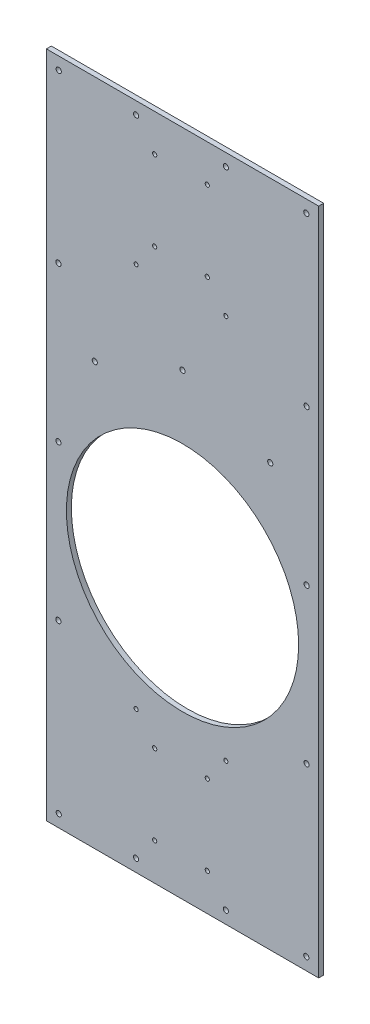
ISO-10303-21;
HEADER;
FILE_DESCRIPTION(('STEP AP214'),'2;1');
FILE_NAME('part.step','',(''),(''),'','','');
FILE_SCHEMA(('AUTOMOTIVE_DESIGN { 1 0 10303 214 1 1 1 1 }'));
ENDSEC;
DATA;
#1=APPLICATION_CONTEXT('core data for automotive mechanical design processes');
#2=APPLICATION_PROTOCOL_DEFINITION('international standard','automotive_design',2000,#1);
#3=PRODUCT_CONTEXT('',#1,'mechanical');
#4=PRODUCT('Part','Part','',(#3));
#5=PRODUCT_RELATED_PRODUCT_CATEGORY('part','',(#4));
#6=PRODUCT_DEFINITION_FORMATION('','',#4);
#7=PRODUCT_DEFINITION_CONTEXT('part definition',#1,'design');
#8=PRODUCT_DEFINITION('design','',#6,#7);
#9=PRODUCT_DEFINITION_SHAPE('','',#8);
#10=(LENGTH_UNIT() NAMED_UNIT(*) SI_UNIT(.MILLI.,.METRE.));
#11=(NAMED_UNIT(*) PLANE_ANGLE_UNIT() SI_UNIT($,.RADIAN.));
#12=(NAMED_UNIT(*) SI_UNIT($,.STERADIAN.) SOLID_ANGLE_UNIT());
#13=UNCERTAINTY_MEASURE_WITH_UNIT(LENGTH_MEASURE(1.E-05),#10,'distance_accuracy_value','');
#14=(GEOMETRIC_REPRESENTATION_CONTEXT(3) GLOBAL_UNCERTAINTY_ASSIGNED_CONTEXT((#13)) GLOBAL_UNIT_ASSIGNED_CONTEXT((#10,
#11,#12)) REPRESENTATION_CONTEXT('',''));
#15=CARTESIAN_POINT('',(0.,0.,0.));
#16=DIRECTION('',(0.,0.,1.));
#17=DIRECTION('',(1.,0.,0.));
#18=AXIS2_PLACEMENT_3D('',#15,#16,#17);
#19=CARTESIAN_POINT('',(110.,-270.,4.));
#20=DIRECTION('',(-1.,0.,0.));
#21=DIRECTION('',(0.,-1.,0.));
#22=AXIS2_PLACEMENT_3D('',#19,#20,#21);
#23=PLANE('',#22);
#24=DIRECTION('',(0.,1.,0.));
#25=VECTOR('',#24,1.);
#26=CARTESIAN_POINT('',(110.,-270.,0.));
#27=LINE('',#26,#25);
#28=CARTESIAN_POINT('',(110.,-270.,0.));
#29=VERTEX_POINT('',#28);
#30=CARTESIAN_POINT('',(110.,270.,0.));
#31=VERTEX_POINT('',#30);
#32=EDGE_CURVE('E111',#29,#31,#27,.T.);
#33=ORIENTED_EDGE('',*,*,#32,.T.);
#34=DIRECTION('',(0.,0.,-1.));
#35=VECTOR('',#34,1.);
#36=CARTESIAN_POINT('',(110.,270.,4.));
#37=LINE('',#36,#35);
#38=CARTESIAN_POINT('',(110.,270.,4.));
#39=VERTEX_POINT('',#38);
#40=EDGE_CURVE('E11',#39,#31,#37,.T.);
#41=ORIENTED_EDGE('',*,*,#40,.F.);
#42=DIRECTION('',(0.,1.,0.));
#43=VECTOR('',#42,1.);
#44=CARTESIAN_POINT('',(110.,-270.,4.));
#45=LINE('',#44,#43);
#46=CARTESIAN_POINT('',(110.,-270.,4.));
#47=VERTEX_POINT('',#46);
#48=EDGE_CURVE('E98',#47,#39,#45,.T.);
#49=ORIENTED_EDGE('',*,*,#48,.F.);
#50=DIRECTION('',(0.,0.,-1.));
#51=VECTOR('',#50,1.);
#52=CARTESIAN_POINT('',(110.,-270.,4.));
#53=LINE('',#52,#51);
#54=EDGE_CURVE('E107',#47,#29,#53,.T.);
#55=ORIENTED_EDGE('',*,*,#54,.T.);
#56=EDGE_LOOP('',(#33,#41,#49,#55));
#57=FACE_BOUND('',#56,.T.);
#58=ADVANCED_FACE('F45',(#57),#23,.F.);
#59=CARTESIAN_POINT('',(-110.,270.,4.));
#60=DIRECTION('',(0.,-1.,0.));
#61=DIRECTION('',(0.,0.,-1.));
#62=AXIS2_PLACEMENT_3D('',#59,#60,#61);
#63=PLANE('',#62);
#64=DIRECTION('',(-1.,0.,0.));
#65=VECTOR('',#64,1.);
#66=CARTESIAN_POINT('',(-110.,270.,0.));
#67=LINE('',#66,#65);
#68=CARTESIAN_POINT('',(-110.,270.,0.));
#69=VERTEX_POINT('',#68);
#70=EDGE_CURVE('E102',#31,#69,#67,.T.);
#71=ORIENTED_EDGE('',*,*,#70,.T.);
#72=DIRECTION('',(0.,0.,-1.));
#73=VECTOR('',#72,1.);
#74=CARTESIAN_POINT('',(-110.,270.,4.));
#75=LINE('',#74,#73);
#76=CARTESIAN_POINT('',(-110.,270.,4.));
#77=VERTEX_POINT('',#76);
#78=EDGE_CURVE('E54',#77,#69,#75,.T.);
#79=ORIENTED_EDGE('',*,*,#78,.F.);
#80=DIRECTION('',(-1.,0.,0.));
#81=VECTOR('',#80,1.);
#82=CARTESIAN_POINT('',(-110.,270.,4.));
#83=LINE('',#82,#81);
#84=EDGE_CURVE('E93',#39,#77,#83,.T.);
#85=ORIENTED_EDGE('',*,*,#84,.F.);
#86=ORIENTED_EDGE('',*,*,#40,.T.);
#87=EDGE_LOOP('',(#71,#79,#85,#86));
#88=FACE_BOUND('',#87,.T.);
#89=ADVANCED_FACE('F101',(#88),#63,.F.);
#90=CARTESIAN_POINT('',(-110.,-270.,4.));
#91=DIRECTION('',(1.,0.,0.));
#92=DIRECTION('',(0.,1.,0.));
#93=AXIS2_PLACEMENT_3D('',#90,#91,#92);
#94=PLANE('',#93);
#95=DIRECTION('',(0.,-1.,0.));
#96=VECTOR('',#95,1.);
#97=CARTESIAN_POINT('',(-110.,-270.,0.));
#98=LINE('',#97,#96);
#99=CARTESIAN_POINT('',(-110.,-270.,0.));
#100=VERTEX_POINT('',#99);
#101=EDGE_CURVE('E80',#69,#100,#98,.T.);
#102=ORIENTED_EDGE('',*,*,#101,.T.);
#103=DIRECTION('',(0.,0.,-1.));
#104=VECTOR('',#103,1.);
#105=CARTESIAN_POINT('',(-110.,-270.,4.));
#106=LINE('',#105,#104);
#107=CARTESIAN_POINT('',(-110.,-270.,4.));
#108=VERTEX_POINT('',#107);
#109=EDGE_CURVE('E103',#108,#100,#106,.T.);
#110=ORIENTED_EDGE('',*,*,#109,.F.);
#111=DIRECTION('',(0.,-1.,0.));
#112=VECTOR('',#111,1.);
#113=CARTESIAN_POINT('',(-110.,-270.,4.));
#114=LINE('',#113,#112);
#115=EDGE_CURVE('E96',#77,#108,#114,.T.);
#116=ORIENTED_EDGE('',*,*,#115,.F.);
#117=ORIENTED_EDGE('',*,*,#78,.T.);
#118=EDGE_LOOP('',(#102,#110,#116,#117));
#119=FACE_BOUND('',#118,.T.);
#120=ADVANCED_FACE('F105',(#119),#94,.F.);
#121=CARTESIAN_POINT('',(-110.,-270.,4.));
#122=DIRECTION('',(0.,1.,0.));
#123=DIRECTION('',(0.,0.,1.));
#124=AXIS2_PLACEMENT_3D('',#121,#122,#123);
#125=PLANE('',#124);
#126=DIRECTION('',(1.,0.,0.));
#127=VECTOR('',#126,1.);
#128=CARTESIAN_POINT('',(-110.,-270.,0.));
#129=LINE('',#128,#127);
#130=EDGE_CURVE('E86',#100,#29,#129,.T.);
#131=ORIENTED_EDGE('',*,*,#130,.T.);
#132=ORIENTED_EDGE('',*,*,#54,.F.);
#133=DIRECTION('',(1.,0.,0.));
#134=VECTOR('',#133,1.);
#135=CARTESIAN_POINT('',(-110.,-270.,4.));
#136=LINE('',#135,#134);
#137=EDGE_CURVE('E63',#108,#47,#136,.T.);
#138=ORIENTED_EDGE('',*,*,#137,.F.);
#139=ORIENTED_EDGE('',*,*,#109,.T.);
#140=EDGE_LOOP('',(#131,#132,#138,#139));
#141=FACE_BOUND('',#140,.T.);
#142=ADVANCED_FACE('F216',(#141),#125,.F.);
#143=CARTESIAN_POINT('',(0.,0.,4.));
#144=DIRECTION('',(0.,0.,-1.));
#145=DIRECTION('',(-1.,0.,0.));
#146=AXIS2_PLACEMENT_3D('',#143,#144,#145);
#147=PLANE('',#146);
#148=CARTESIAN_POINT('',(-37.5000000000005,-155.525642790935,4.));
#149=DIRECTION('',(0.,0.,1.));
#150=DIRECTION('',(-1.,0.,0.));
#151=AXIS2_PLACEMENT_3D('',#148,#149,#150);
#152=CIRCLE('',#151,1.65000000000016);
#153=CARTESIAN_POINT('',(-39.1500000000006,-155.525642790935,4.));
#154=VERTEX_POINT('',#153);
#155=EDGE_CURVE('E561',#154,#154,#152,.T.);
#156=ORIENTED_EDGE('',*,*,#155,.F.);
#157=EDGE_LOOP('',(#156));
#158=FACE_BOUND('',#157,.T.);
#159=CARTESIAN_POINT('',(19.9999999999996,-239.999999999999,4.));
#160=DIRECTION('',(0.,0.,1.));
#161=DIRECTION('',(-1.,0.,0.));
#162=AXIS2_PLACEMENT_3D('',#159,#160,#161);
#163=CIRCLE('',#162,1.7000000000006);
#164=CARTESIAN_POINT('',(18.299999999999,-239.999999999999,4.));
#165=VERTEX_POINT('',#164);
#166=EDGE_CURVE('E577',#165,#165,#163,.T.);
#167=ORIENTED_EDGE('',*,*,#166,.F.);
#168=EDGE_LOOP('',(#167));
#169=FACE_BOUND('',#168,.T.);
#170=CARTESIAN_POINT('',(-22.5000000000005,-175.525642790935,4.));
#171=DIRECTION('',(0.,0.,1.));
#172=DIRECTION('',(-1.,0.,0.));
#173=AXIS2_PLACEMENT_3D('',#170,#171,#172);
#174=CIRCLE('',#173,1.70000000000016);
#175=CARTESIAN_POINT('',(-24.2000000000006,-175.525642790935,4.));
#176=VERTEX_POINT('',#175);
#177=EDGE_CURVE('E756',#176,#176,#174,.T.);
#178=ORIENTED_EDGE('',*,*,#177,.F.);
#179=EDGE_LOOP('',(#178));
#180=FACE_BOUND('',#179,.T.);
#181=CARTESIAN_POINT('',(19.9999999999995,-175.525642790936,4.));
#182=DIRECTION('',(0.,0.,1.));
#183=DIRECTION('',(-1.,0.,0.));
#184=AXIS2_PLACEMENT_3D('',#181,#182,#183);
#185=CIRCLE('',#184,1.70000000000015);
#186=CARTESIAN_POINT('',(18.2999999999994,-175.525642790936,4.));
#187=VERTEX_POINT('',#186);
#188=EDGE_CURVE('E764',#187,#187,#185,.T.);
#189=ORIENTED_EDGE('',*,*,#188,.F.);
#190=EDGE_LOOP('',(#189));
#191=FACE_BOUND('',#190,.T.);
#192=CARTESIAN_POINT('',(34.9999999999995,-155.525642790935,4.));
#193=DIRECTION('',(0.,0.,1.));
#194=DIRECTION('',(-1.,0.,0.));
#195=AXIS2_PLACEMENT_3D('',#192,#193,#194);
#196=CIRCLE('',#195,1.65000000000015);
#197=CARTESIAN_POINT('',(33.3499999999994,-155.525642790935,4.));
#198=VERTEX_POINT('',#197);
#199=EDGE_CURVE('E772',#198,#198,#196,.T.);
#200=ORIENTED_EDGE('',*,*,#199,.F.);
#201=EDGE_LOOP('',(#200));
#202=FACE_BOUND('',#201,.T.);
#203=CARTESIAN_POINT('',(-22.5000000000004,-239.999999999999,4.));
#204=DIRECTION('',(0.,0.,1.));
#205=DIRECTION('',(-1.,0.,0.));
#206=AXIS2_PLACEMENT_3D('',#203,#204,#205);
#207=CIRCLE('',#206,1.70000000000059);
#208=CARTESIAN_POINT('',(-24.200000000001,-239.999999999999,4.));
#209=VERTEX_POINT('',#208);
#210=EDGE_CURVE('E570',#209,#209,#207,.T.);
#211=ORIENTED_EDGE('',*,*,#210,.F.);
#212=EDGE_LOOP('',(#211));
#213=FACE_BOUND('',#212,.T.);
#214=CARTESIAN_POINT('',(-37.5000000000005,155.525642790935,4.));
#215=DIRECTION('',(0.,0.,-1.));
#216=DIRECTION('',(-1.,0.,0.));
#217=AXIS2_PLACEMENT_3D('',#214,#215,#216);
#218=CIRCLE('',#217,1.65000000000016);
#219=CARTESIAN_POINT('',(-39.1500000000006,155.525642790935,4.));
#220=VERTEX_POINT('',#219);
#221=EDGE_CURVE('E591',#220,#220,#218,.T.);
#222=ORIENTED_EDGE('',*,*,#221,.T.);
#223=EDGE_LOOP('',(#222));
#224=FACE_BOUND('',#223,.T.);
#225=CARTESIAN_POINT('',(19.9999999999996,239.999999999999,4.));
#226=DIRECTION('',(0.,0.,-1.));
#227=DIRECTION('',(-1.,0.,0.));
#228=AXIS2_PLACEMENT_3D('',#225,#226,#227);
#229=CIRCLE('',#228,1.7000000000006);
#230=CARTESIAN_POINT('',(18.299999999999,239.999999999999,4.));
#231=VERTEX_POINT('',#230);
#232=EDGE_CURVE('E592',#231,#231,#229,.T.);
#233=ORIENTED_EDGE('',*,*,#232,.T.);
#234=EDGE_LOOP('',(#233));
#235=FACE_BOUND('',#234,.T.);
#236=CARTESIAN_POINT('',(-22.5000000000005,175.525642790935,4.));
#237=DIRECTION('',(0.,0.,-1.));
#238=DIRECTION('',(-1.,0.,0.));
#239=AXIS2_PLACEMENT_3D('',#236,#237,#238);
#240=CIRCLE('',#239,1.70000000000016);
#241=CARTESIAN_POINT('',(-24.2000000000006,175.525642790935,4.));
#242=VERTEX_POINT('',#241);
#243=EDGE_CURVE('E599',#242,#242,#240,.T.);
#244=ORIENTED_EDGE('',*,*,#243,.T.);
#245=EDGE_LOOP('',(#244));
#246=FACE_BOUND('',#245,.T.);
#247=CARTESIAN_POINT('',(19.9999999999995,175.525642790936,4.));
#248=DIRECTION('',(0.,0.,-1.));
#249=DIRECTION('',(-1.,0.,0.));
#250=AXIS2_PLACEMENT_3D('',#247,#248,#249);
#251=CIRCLE('',#250,1.70000000000015);
#252=CARTESIAN_POINT('',(18.2999999999994,175.525642790936,4.));
#253=VERTEX_POINT('',#252);
#254=EDGE_CURVE('E578',#253,#253,#251,.T.);
#255=ORIENTED_EDGE('',*,*,#254,.T.);
#256=EDGE_LOOP('',(#255));
#257=FACE_BOUND('',#256,.T.);
#258=CARTESIAN_POINT('',(34.9999999999995,155.525642790935,4.));
#259=DIRECTION('',(0.,0.,-1.));
#260=DIRECTION('',(-1.,0.,0.));
#261=AXIS2_PLACEMENT_3D('',#258,#259,#260);
#262=CIRCLE('',#261,1.65000000000015);
#263=CARTESIAN_POINT('',(33.3499999999994,155.525642790935,4.));
#264=VERTEX_POINT('',#263);
#265=EDGE_CURVE('E585',#264,#264,#262,.T.);
#266=ORIENTED_EDGE('',*,*,#265,.T.);
#267=EDGE_LOOP('',(#266));
#268=FACE_BOUND('',#267,.T.);
#269=CARTESIAN_POINT('',(-22.5000000000004,239.999999999999,4.));
#270=DIRECTION('',(0.,0.,-1.));
#271=DIRECTION('',(-1.,0.,0.));
#272=AXIS2_PLACEMENT_3D('',#269,#270,#271);
#273=CIRCLE('',#272,1.70000000000059);
#274=CARTESIAN_POINT('',(-24.200000000001,239.999999999999,4.));
#275=VERTEX_POINT('',#274);
#276=EDGE_CURVE('E608',#275,#275,#273,.T.);
#277=ORIENTED_EDGE('',*,*,#276,.T.);
#278=EDGE_LOOP('',(#277));
#279=FACE_BOUND('',#278,.T.);
#280=CARTESIAN_POINT('',(100.25,0.,4.));
#281=DIRECTION('',(0.,0.,1.));
#282=DIRECTION('',(1.,0.,0.));
#283=AXIS2_PLACEMENT_3D('',#280,#281,#282);
#284=CIRCLE('',#283,2.1);
#285=CARTESIAN_POINT('',(102.35,0.,4.));
#286=VERTEX_POINT('',#285);
#287=EDGE_CURVE('E620',#286,#286,#284,.T.);
#288=ORIENTED_EDGE('',*,*,#287,.F.);
#289=EDGE_LOOP('',(#288));
#290=FACE_BOUND('',#289,.T.);
#291=CARTESIAN_POINT('',(70.8874548139515,70.8874548139514,4.));
#292=DIRECTION('',(0.,0.,1.));
#293=DIRECTION('',(1.,0.,0.));
#294=AXIS2_PLACEMENT_3D('',#291,#292,#293);
#295=CIRCLE('',#294,2.1);
#296=CARTESIAN_POINT('',(72.9874548139515,70.8874548139514,4.));
#297=VERTEX_POINT('',#296);
#298=EDGE_CURVE('E625',#297,#297,#295,.T.);
#299=ORIENTED_EDGE('',*,*,#298,.F.);
#300=EDGE_LOOP('',(#299));
#301=FACE_BOUND('',#300,.T.);
#302=CARTESIAN_POINT('',(0.,100.25,4.));
#303=DIRECTION('',(0.,0.,1.));
#304=DIRECTION('',(1.,0.,0.));
#305=AXIS2_PLACEMENT_3D('',#302,#303,#304);
#306=CIRCLE('',#305,2.10000000000001);
#307=CARTESIAN_POINT('',(2.10000000000006,100.25,4.));
#308=VERTEX_POINT('',#307);
#309=EDGE_CURVE('E632',#308,#308,#306,.T.);
#310=ORIENTED_EDGE('',*,*,#309,.F.);
#311=EDGE_LOOP('',(#310));
#312=FACE_BOUND('',#311,.T.);
#313=CARTESIAN_POINT('',(-70.8874548139513,70.8874548139514,4.));
#314=DIRECTION('',(0.,0.,1.));
#315=DIRECTION('',(1.,0.,0.));
#316=AXIS2_PLACEMENT_3D('',#313,#314,#315);
#317=CIRCLE('',#316,2.1);
#318=CARTESIAN_POINT('',(-68.7874548139513,70.8874548139514,4.));
#319=VERTEX_POINT('',#318);
#320=EDGE_CURVE('E629',#319,#319,#317,.T.);
#321=ORIENTED_EDGE('',*,*,#320,.F.);
#322=EDGE_LOOP('',(#321));
#323=FACE_BOUND('',#322,.T.);
#324=CARTESIAN_POINT('',(-100.25,-125.,4.));
#325=DIRECTION('',(0.,0.,1.));
#326=DIRECTION('',(1.,0.,0.));
#327=AXIS2_PLACEMENT_3D('',#324,#325,#326);
#328=CIRCLE('',#327,2.1);
#329=CARTESIAN_POINT('',(-98.1499999999999,-125.,4.));
#330=VERTEX_POINT('',#329);
#331=EDGE_CURVE('E626',#330,#330,#328,.T.);
#332=ORIENTED_EDGE('',*,*,#331,.F.);
#333=EDGE_LOOP('',(#332));
#334=FACE_BOUND('',#333,.T.);
#335=CARTESIAN_POINT('',(100.25,125.,4.));
#336=DIRECTION('',(0.,0.,1.));
#337=DIRECTION('',(1.,0.,0.));
#338=AXIS2_PLACEMENT_3D('',#335,#336,#337);
#339=CIRCLE('',#338,2.1);
#340=CARTESIAN_POINT('',(102.35,125.,4.));
#341=VERTEX_POINT('',#340);
#342=EDGE_CURVE('E611',#341,#341,#339,.T.);
#343=ORIENTED_EDGE('',*,*,#342,.F.);
#344=EDGE_LOOP('',(#343));
#345=FACE_BOUND('',#344,.T.);
#346=CARTESIAN_POINT('',(-100.25,125.,4.));
#347=DIRECTION('',(0.,0.,1.));
#348=DIRECTION('',(-1.,0.,0.));
#349=AXIS2_PLACEMENT_3D('',#346,#347,#348);
#350=CIRCLE('',#349,2.1);
#351=CARTESIAN_POINT('',(-102.35,125.,4.));
#352=VERTEX_POINT('',#351);
#353=EDGE_CURVE('E616',#352,#352,#350,.T.);
#354=ORIENTED_EDGE('',*,*,#353,.F.);
#355=EDGE_LOOP('',(#354));
#356=FACE_BOUND('',#355,.T.);
#357=CARTESIAN_POINT('',(100.25,-125.,4.));
#358=DIRECTION('',(0.,0.,1.));
#359=DIRECTION('',(-1.,0.,0.));
#360=AXIS2_PLACEMENT_3D('',#357,#358,#359);
#361=CIRCLE('',#360,2.1);
#362=CARTESIAN_POINT('',(98.1500000000001,-125.,4.));
#363=VERTEX_POINT('',#362);
#364=EDGE_CURVE('E617',#363,#363,#361,.T.);
#365=ORIENTED_EDGE('',*,*,#364,.F.);
#366=EDGE_LOOP('',(#365));
#367=FACE_BOUND('',#366,.T.);
#368=CARTESIAN_POINT('',(-100.25,0.,4.));
#369=DIRECTION('',(0.,0.,1.));
#370=DIRECTION('',(1.,0.,0.));
#371=AXIS2_PLACEMENT_3D('',#368,#369,#370);
#372=CIRCLE('',#371,2.1);
#373=CARTESIAN_POINT('',(-98.1499999999999,0.,4.));
#374=VERTEX_POINT('',#373);
#375=EDGE_CURVE('E129',#374,#374,#372,.T.);
#376=ORIENTED_EDGE('',*,*,#375,.F.);
#377=EDGE_LOOP('',(#376));
#378=FACE_BOUND('',#377,.T.);
#379=CARTESIAN_POINT('',(0.,-45.,4.));
#380=DIRECTION('',(0.,0.,1.));
#381=DIRECTION('',(1.,0.,0.));
#382=AXIS2_PLACEMENT_3D('',#379,#380,#381);
#383=CIRCLE('',#382,93.8);
#384=CARTESIAN_POINT('',(93.8,-45.,4.));
#385=VERTEX_POINT('',#384);
#386=EDGE_CURVE('E124',#385,#385,#383,.T.);
#387=ORIENTED_EDGE('',*,*,#386,.F.);
#388=EDGE_LOOP('',(#387));
#389=FACE_BOUND('',#388,.T.);
#390=CARTESIAN_POINT('',(-37.5000000000001,-260.,4.));
#391=DIRECTION('',(0.,0.,-1.));
#392=DIRECTION('',(1.,0.,0.));
#393=AXIS2_PLACEMENT_3D('',#390,#391,#392);
#394=CIRCLE('',#393,2.09999999999999);
#395=CARTESIAN_POINT('',(-35.4000000000001,-260.,4.));
#396=VERTEX_POINT('',#395);
#397=EDGE_CURVE('E185',#396,#396,#394,.T.);
#398=ORIENTED_EDGE('',*,*,#397,.T.);
#399=EDGE_LOOP('',(#398));
#400=FACE_BOUND('',#399,.T.);
#401=CARTESIAN_POINT('',(100.,-260.,4.));
#402=DIRECTION('',(0.,0.,-1.));
#403=DIRECTION('',(-1.,0.,0.));
#404=AXIS2_PLACEMENT_3D('',#401,#402,#403);
#405=CIRCLE('',#404,2.1);
#406=CARTESIAN_POINT('',(97.9,-260.,4.));
#407=VERTEX_POINT('',#406);
#408=EDGE_CURVE('E178',#407,#407,#405,.T.);
#409=ORIENTED_EDGE('',*,*,#408,.T.);
#410=EDGE_LOOP('',(#409));
#411=FACE_BOUND('',#410,.T.);
#412=CARTESIAN_POINT('',(-99.9999999999999,-260.,4.));
#413=DIRECTION('',(0.,0.,-1.));
#414=DIRECTION('',(-1.,0.,0.));
#415=AXIS2_PLACEMENT_3D('',#412,#413,#414);
#416=CIRCLE('',#415,2.1);
#417=CARTESIAN_POINT('',(-102.1,-260.,4.));
#418=VERTEX_POINT('',#417);
#419=EDGE_CURVE('E197',#418,#418,#416,.T.);
#420=ORIENTED_EDGE('',*,*,#419,.T.);
#421=EDGE_LOOP('',(#420));
#422=FACE_BOUND('',#421,.T.);
#423=CARTESIAN_POINT('',(-37.5,260.,4.));
#424=DIRECTION('',(0.,0.,-1.));
#425=DIRECTION('',(-1.,0.,0.));
#426=AXIS2_PLACEMENT_3D('',#423,#424,#425);
#427=CIRCLE('',#426,2.09999999999999);
#428=CARTESIAN_POINT('',(-39.5999999999999,260.,4.));
#429=VERTEX_POINT('',#428);
#430=EDGE_CURVE('E190',#429,#429,#427,.T.);
#431=ORIENTED_EDGE('',*,*,#430,.T.);
#432=EDGE_LOOP('',(#431));
#433=FACE_BOUND('',#432,.T.);
#434=CARTESIAN_POINT('',(35.,260.,4.));
#435=DIRECTION('',(0.,0.,-1.));
#436=DIRECTION('',(1.,0.,0.));
#437=AXIS2_PLACEMENT_3D('',#434,#435,#436);
#438=CIRCLE('',#437,2.09999999999999);
#439=CARTESIAN_POINT('',(37.1,260.,4.));
#440=VERTEX_POINT('',#439);
#441=EDGE_CURVE('E160',#440,#440,#438,.T.);
#442=ORIENTED_EDGE('',*,*,#441,.T.);
#443=EDGE_LOOP('',(#442));
#444=FACE_BOUND('',#443,.T.);
#445=CARTESIAN_POINT('',(100.,260.,4.));
#446=DIRECTION('',(0.,0.,-1.));
#447=DIRECTION('',(1.,0.,0.));
#448=AXIS2_PLACEMENT_3D('',#445,#446,#447);
#449=CIRCLE('',#448,2.1);
#450=CARTESIAN_POINT('',(102.1,260.,4.));
#451=VERTEX_POINT('',#450);
#452=EDGE_CURVE('E173',#451,#451,#449,.T.);
#453=ORIENTED_EDGE('',*,*,#452,.T.);
#454=EDGE_LOOP('',(#453));
#455=FACE_BOUND('',#454,.T.);
#456=CARTESIAN_POINT('',(-99.9999999999999,260.,4.));
#457=DIRECTION('',(0.,0.,-1.));
#458=DIRECTION('',(1.,0.,0.));
#459=AXIS2_PLACEMENT_3D('',#456,#457,#458);
#460=CIRCLE('',#459,2.1);
#461=CARTESIAN_POINT('',(-97.8999999999999,260.,4.));
#462=VERTEX_POINT('',#461);
#463=EDGE_CURVE('E166',#462,#462,#460,.T.);
#464=ORIENTED_EDGE('',*,*,#463,.T.);
#465=EDGE_LOOP('',(#464));
#466=FACE_BOUND('',#465,.T.);
#467=CARTESIAN_POINT('',(35.,-260.,4.));
#468=DIRECTION('',(0.,0.,-1.));
#469=DIRECTION('',(-1.,0.,0.));
#470=AXIS2_PLACEMENT_3D('',#467,#468,#469);
#471=CIRCLE('',#470,2.09999999999999);
#472=CARTESIAN_POINT('',(32.9,-260.,4.));
#473=VERTEX_POINT('',#472);
#474=EDGE_CURVE('E114',#473,#473,#471,.T.);
#475=ORIENTED_EDGE('',*,*,#474,.T.);
#476=EDGE_LOOP('',(#475));
#477=FACE_BOUND('',#476,.T.);
#478=ORIENTED_EDGE('',*,*,#48,.T.);
#479=ORIENTED_EDGE('',*,*,#84,.T.);
#480=ORIENTED_EDGE('',*,*,#115,.T.);
#481=ORIENTED_EDGE('',*,*,#137,.T.);
#482=EDGE_LOOP('',(#478,#479,#480,#481));
#483=FACE_BOUND('',#482,.T.);
#484=ADVANCED_FACE('F94',(#158,#169,#180,#191,#202,#213,#224,#235,#246,#257,#268,#279,#290,#301,
#312,#323,#334,#345,#356,#367,#378,#389,#400,#411,#422,#433,#444,#455,#466,#477,#483),#147,.F.);
#485=CARTESIAN_POINT('',(0.,0.,0.));
#486=DIRECTION('',(0.,0.,-1.));
#487=DIRECTION('',(-1.,0.,0.));
#488=AXIS2_PLACEMENT_3D('',#485,#486,#487);
#489=PLANE('',#488);
#490=CARTESIAN_POINT('',(-37.5000000000005,-155.525642790935,0.));
#491=DIRECTION('',(0.,0.,1.));
#492=DIRECTION('',(-1.,0.,0.));
#493=AXIS2_PLACEMENT_3D('',#490,#491,#492);
#494=CIRCLE('',#493,1.65000000000016);
#495=CARTESIAN_POINT('',(-39.1500000000006,-155.525642790935,0.));
#496=VERTEX_POINT('',#495);
#497=EDGE_CURVE('E564',#496,#496,#494,.T.);
#498=ORIENTED_EDGE('',*,*,#497,.T.);
#499=EDGE_LOOP('',(#498));
#500=FACE_BOUND('',#499,.T.);
#501=CARTESIAN_POINT('',(19.9999999999996,-239.999999999999,0.));
#502=DIRECTION('',(0.,0.,1.));
#503=DIRECTION('',(-1.,0.,0.));
#504=AXIS2_PLACEMENT_3D('',#501,#502,#503);
#505=CIRCLE('',#504,1.7000000000006);
#506=CARTESIAN_POINT('',(18.299999999999,-239.999999999999,0.));
#507=VERTEX_POINT('',#506);
#508=EDGE_CURVE('E752',#507,#507,#505,.T.);
#509=ORIENTED_EDGE('',*,*,#508,.T.);
#510=EDGE_LOOP('',(#509));
#511=FACE_BOUND('',#510,.T.);
#512=CARTESIAN_POINT('',(-22.5000000000005,-175.525642790935,0.));
#513=DIRECTION('',(0.,0.,1.));
#514=DIRECTION('',(-1.,0.,0.));
#515=AXIS2_PLACEMENT_3D('',#512,#513,#514);
#516=CIRCLE('',#515,1.70000000000016);
#517=CARTESIAN_POINT('',(-24.2000000000006,-175.525642790935,0.));
#518=VERTEX_POINT('',#517);
#519=EDGE_CURVE('E762',#518,#518,#516,.T.);
#520=ORIENTED_EDGE('',*,*,#519,.T.);
#521=EDGE_LOOP('',(#520));
#522=FACE_BOUND('',#521,.T.);
#523=CARTESIAN_POINT('',(19.9999999999995,-175.525642790936,0.));
#524=DIRECTION('',(0.,0.,1.));
#525=DIRECTION('',(-1.,0.,0.));
#526=AXIS2_PLACEMENT_3D('',#523,#524,#525);
#527=CIRCLE('',#526,1.70000000000015);
#528=CARTESIAN_POINT('',(18.2999999999994,-175.525642790936,0.));
#529=VERTEX_POINT('',#528);
#530=EDGE_CURVE('E768',#529,#529,#527,.T.);
#531=ORIENTED_EDGE('',*,*,#530,.T.);
#532=EDGE_LOOP('',(#531));
#533=FACE_BOUND('',#532,.T.);
#534=CARTESIAN_POINT('',(34.9999999999995,-155.525642790935,0.));
#535=DIRECTION('',(0.,0.,1.));
#536=DIRECTION('',(-1.,0.,0.));
#537=AXIS2_PLACEMENT_3D('',#534,#535,#536);
#538=CIRCLE('',#537,1.65000000000015);
#539=CARTESIAN_POINT('',(33.3499999999994,-155.525642790935,0.));
#540=VERTEX_POINT('',#539);
#541=EDGE_CURVE('E566',#540,#540,#538,.T.);
#542=ORIENTED_EDGE('',*,*,#541,.T.);
#543=EDGE_LOOP('',(#542));
#544=FACE_BOUND('',#543,.T.);
#545=CARTESIAN_POINT('',(-22.5000000000004,-239.999999999999,0.));
#546=DIRECTION('',(0.,0.,1.));
#547=DIRECTION('',(-1.,0.,0.));
#548=AXIS2_PLACEMENT_3D('',#545,#546,#547);
#549=CIRCLE('',#548,1.70000000000059);
#550=CARTESIAN_POINT('',(-24.200000000001,-239.999999999999,0.));
#551=VERTEX_POINT('',#550);
#552=EDGE_CURVE('E574',#551,#551,#549,.T.);
#553=ORIENTED_EDGE('',*,*,#552,.T.);
#554=EDGE_LOOP('',(#553));
#555=FACE_BOUND('',#554,.T.);
#556=CARTESIAN_POINT('',(-37.5000000000005,155.525642790935,0.));
#557=DIRECTION('',(0.,0.,-1.));
#558=DIRECTION('',(-1.,0.,0.));
#559=AXIS2_PLACEMENT_3D('',#556,#557,#558);
#560=CIRCLE('',#559,1.65000000000016);
#561=CARTESIAN_POINT('',(-39.1500000000006,155.525642790935,0.));
#562=VERTEX_POINT('',#561);
#563=EDGE_CURVE('E573',#562,#562,#560,.T.);
#564=ORIENTED_EDGE('',*,*,#563,.F.);
#565=EDGE_LOOP('',(#564));
#566=FACE_BOUND('',#565,.T.);
#567=CARTESIAN_POINT('',(19.9999999999996,239.999999999999,0.));
#568=DIRECTION('',(0.,0.,-1.));
#569=DIRECTION('',(-1.,0.,0.));
#570=AXIS2_PLACEMENT_3D('',#567,#568,#569);
#571=CIRCLE('',#570,1.7000000000006);
#572=CARTESIAN_POINT('',(18.299999999999,239.999999999999,0.));
#573=VERTEX_POINT('',#572);
#574=EDGE_CURVE('E596',#573,#573,#571,.T.);
#575=ORIENTED_EDGE('',*,*,#574,.F.);
#576=EDGE_LOOP('',(#575));
#577=FACE_BOUND('',#576,.T.);
#578=CARTESIAN_POINT('',(-22.5000000000005,175.525642790935,0.));
#579=DIRECTION('',(0.,0.,-1.));
#580=DIRECTION('',(-1.,0.,0.));
#581=AXIS2_PLACEMENT_3D('',#578,#579,#580);
#582=CIRCLE('',#581,1.70000000000016);
#583=CARTESIAN_POINT('',(-24.2000000000006,175.525642790935,0.));
#584=VERTEX_POINT('',#583);
#585=EDGE_CURVE('E581',#584,#584,#582,.T.);
#586=ORIENTED_EDGE('',*,*,#585,.F.);
#587=EDGE_LOOP('',(#586));
#588=FACE_BOUND('',#587,.T.);
#589=CARTESIAN_POINT('',(19.9999999999995,175.525642790936,0.));
#590=DIRECTION('',(0.,0.,-1.));
#591=DIRECTION('',(-1.,0.,0.));
#592=AXIS2_PLACEMENT_3D('',#589,#590,#591);
#593=CIRCLE('',#592,1.70000000000015);
#594=CARTESIAN_POINT('',(18.2999999999994,175.525642790936,0.));
#595=VERTEX_POINT('',#594);
#596=EDGE_CURVE('E582',#595,#595,#593,.T.);
#597=ORIENTED_EDGE('',*,*,#596,.F.);
#598=EDGE_LOOP('',(#597));
#599=FACE_BOUND('',#598,.T.);
#600=CARTESIAN_POINT('',(34.9999999999995,155.525642790935,0.));
#601=DIRECTION('',(0.,0.,-1.));
#602=DIRECTION('',(-1.,0.,0.));
#603=AXIS2_PLACEMENT_3D('',#600,#601,#602);
#604=CIRCLE('',#603,1.65000000000015);
#605=CARTESIAN_POINT('',(33.3499999999994,155.525642790935,0.));
#606=VERTEX_POINT('',#605);
#607=EDGE_CURVE('E588',#606,#606,#604,.T.);
#608=ORIENTED_EDGE('',*,*,#607,.F.);
#609=EDGE_LOOP('',(#608));
#610=FACE_BOUND('',#609,.T.);
#611=CARTESIAN_POINT('',(-22.5000000000004,239.999999999999,0.));
#612=DIRECTION('',(0.,0.,-1.));
#613=DIRECTION('',(-1.,0.,0.));
#614=AXIS2_PLACEMENT_3D('',#611,#612,#613);
#615=CIRCLE('',#614,1.70000000000059);
#616=CARTESIAN_POINT('',(-24.200000000001,239.999999999999,0.));
#617=VERTEX_POINT('',#616);
#618=EDGE_CURVE('E595',#617,#617,#615,.T.);
#619=ORIENTED_EDGE('',*,*,#618,.F.);
#620=EDGE_LOOP('',(#619));
#621=FACE_BOUND('',#620,.T.);
#622=CARTESIAN_POINT('',(100.25,0.,0.));
#623=DIRECTION('',(0.,0.,-1.));
#624=DIRECTION('',(-1.,0.,0.));
#625=AXIS2_PLACEMENT_3D('',#622,#623,#624);
#626=CIRCLE('',#625,2.1);
#627=CARTESIAN_POINT('',(98.1500000000001,0.,0.));
#628=VERTEX_POINT('',#627);
#629=EDGE_CURVE('E48',#628,#628,#626,.T.);
#630=ORIENTED_EDGE('',*,*,#629,.F.);
#631=EDGE_LOOP('',(#630));
#632=FACE_BOUND('',#631,.T.);
#633=CARTESIAN_POINT('',(70.8874548139515,70.8874548139514,0.));
#634=DIRECTION('',(0.,0.,-1.));
#635=DIRECTION('',(-1.,0.,0.));
#636=AXIS2_PLACEMENT_3D('',#633,#634,#635);
#637=CIRCLE('',#636,2.1);
#638=CARTESIAN_POINT('',(68.7874548139514,70.8874548139514,0.));
#639=VERTEX_POINT('',#638);
#640=EDGE_CURVE('E146',#639,#639,#637,.T.);
#641=ORIENTED_EDGE('',*,*,#640,.F.);
#642=EDGE_LOOP('',(#641));
#643=FACE_BOUND('',#642,.T.);
#644=CARTESIAN_POINT('',(0.,100.25,0.));
#645=DIRECTION('',(0.,0.,-1.));
#646=DIRECTION('',(-1.,0.,0.));
#647=AXIS2_PLACEMENT_3D('',#644,#645,#646);
#648=CIRCLE('',#647,2.10000000000001);
#649=CARTESIAN_POINT('',(-2.09999999999995,100.25,0.));
#650=VERTEX_POINT('',#649);
#651=EDGE_CURVE('E144',#650,#650,#648,.T.);
#652=ORIENTED_EDGE('',*,*,#651,.F.);
#653=EDGE_LOOP('',(#652));
#654=FACE_BOUND('',#653,.T.);
#655=CARTESIAN_POINT('',(-70.8874548139513,70.8874548139514,0.));
#656=DIRECTION('',(0.,0.,-1.));
#657=DIRECTION('',(-1.,0.,0.));
#658=AXIS2_PLACEMENT_3D('',#655,#656,#657);
#659=CIRCLE('',#658,2.1);
#660=CARTESIAN_POINT('',(-72.9874548139513,70.8874548139514,0.));
#661=VERTEX_POINT('',#660);
#662=EDGE_CURVE('E141',#661,#661,#659,.T.);
#663=ORIENTED_EDGE('',*,*,#662,.F.);
#664=EDGE_LOOP('',(#663));
#665=FACE_BOUND('',#664,.T.);
#666=CARTESIAN_POINT('',(-100.25,-125.,0.));
#667=DIRECTION('',(0.,0.,-1.));
#668=DIRECTION('',(-1.,0.,0.));
#669=AXIS2_PLACEMENT_3D('',#666,#667,#668);
#670=CIRCLE('',#669,2.1);
#671=CARTESIAN_POINT('',(-102.35,-125.,0.));
#672=VERTEX_POINT('',#671);
#673=EDGE_CURVE('E138',#672,#672,#670,.T.);
#674=ORIENTED_EDGE('',*,*,#673,.F.);
#675=EDGE_LOOP('',(#674));
#676=FACE_BOUND('',#675,.T.);
#677=CARTESIAN_POINT('',(100.25,125.,0.));
#678=DIRECTION('',(0.,0.,-1.));
#679=DIRECTION('',(-1.,0.,0.));
#680=AXIS2_PLACEMENT_3D('',#677,#678,#679);
#681=CIRCLE('',#680,2.1);
#682=CARTESIAN_POINT('',(98.1500000000001,125.,0.));
#683=VERTEX_POINT('',#682);
#684=EDGE_CURVE('E135',#683,#683,#681,.T.);
#685=ORIENTED_EDGE('',*,*,#684,.F.);
#686=EDGE_LOOP('',(#685));
#687=FACE_BOUND('',#686,.T.);
#688=CARTESIAN_POINT('',(-100.25,125.,0.));
#689=DIRECTION('',(0.,0.,-1.));
#690=DIRECTION('',(-1.,0.,0.));
#691=AXIS2_PLACEMENT_3D('',#688,#689,#690);
#692=CIRCLE('',#691,2.1);
#693=CARTESIAN_POINT('',(-102.35,125.,0.));
#694=VERTEX_POINT('',#693);
#695=EDGE_CURVE('E132',#694,#694,#692,.T.);
#696=ORIENTED_EDGE('',*,*,#695,.F.);
#697=EDGE_LOOP('',(#696));
#698=FACE_BOUND('',#697,.T.);
#699=CARTESIAN_POINT('',(100.25,-125.,0.));
#700=DIRECTION('',(0.,0.,-1.));
#701=DIRECTION('',(-1.,0.,0.));
#702=AXIS2_PLACEMENT_3D('',#699,#700,#701);
#703=CIRCLE('',#702,2.1);
#704=CARTESIAN_POINT('',(98.1500000000001,-125.,0.));
#705=VERTEX_POINT('',#704);
#706=EDGE_CURVE('E128',#705,#705,#703,.T.);
#707=ORIENTED_EDGE('',*,*,#706,.F.);
#708=EDGE_LOOP('',(#707));
#709=FACE_BOUND('',#708,.T.);
#710=CARTESIAN_POINT('',(-100.25,0.,0.));
#711=DIRECTION('',(0.,0.,-1.));
#712=DIRECTION('',(-1.,0.,0.));
#713=AXIS2_PLACEMENT_3D('',#710,#711,#712);
#714=CIRCLE('',#713,2.1);
#715=CARTESIAN_POINT('',(-102.35,0.,0.));
#716=VERTEX_POINT('',#715);
#717=EDGE_CURVE('E125',#716,#716,#714,.T.);
#718=ORIENTED_EDGE('',*,*,#717,.F.);
#719=EDGE_LOOP('',(#718));
#720=FACE_BOUND('',#719,.T.);
#721=CARTESIAN_POINT('',(0.,-45.,0.));
#722=DIRECTION('',(0.,0.,-1.));
#723=DIRECTION('',(-1.,0.,0.));
#724=AXIS2_PLACEMENT_3D('',#721,#722,#723);
#725=CIRCLE('',#724,93.8);
#726=CARTESIAN_POINT('',(-93.8,-45.,0.));
#727=VERTEX_POINT('',#726);
#728=EDGE_CURVE('E120',#727,#727,#725,.T.);
#729=ORIENTED_EDGE('',*,*,#728,.F.);
#730=EDGE_LOOP('',(#729));
#731=FACE_BOUND('',#730,.T.);
#732=CARTESIAN_POINT('',(-37.5000000000001,-260.,0.));
#733=DIRECTION('',(0.,0.,-1.));
#734=DIRECTION('',(1.,0.,0.));
#735=AXIS2_PLACEMENT_3D('',#732,#733,#734);
#736=CIRCLE('',#735,2.09999999999999);
#737=CARTESIAN_POINT('',(-35.4000000000001,-260.,0.));
#738=VERTEX_POINT('',#737);
#739=EDGE_CURVE('E169',#738,#738,#736,.T.);
#740=ORIENTED_EDGE('',*,*,#739,.F.);
#741=EDGE_LOOP('',(#740));
#742=FACE_BOUND('',#741,.T.);
#743=CARTESIAN_POINT('',(100.,-260.,0.));
#744=DIRECTION('',(0.,0.,-1.));
#745=DIRECTION('',(-1.,0.,0.));
#746=AXIS2_PLACEMENT_3D('',#743,#744,#745);
#747=CIRCLE('',#746,2.1);
#748=CARTESIAN_POINT('',(97.9,-260.,0.));
#749=VERTEX_POINT('',#748);
#750=EDGE_CURVE('E182',#749,#749,#747,.T.);
#751=ORIENTED_EDGE('',*,*,#750,.F.);
#752=EDGE_LOOP('',(#751));
#753=FACE_BOUND('',#752,.T.);
#754=CARTESIAN_POINT('',(-99.9999999999999,-260.,0.));
#755=DIRECTION('',(0.,0.,-1.));
#756=DIRECTION('',(-1.,0.,0.));
#757=AXIS2_PLACEMENT_3D('',#754,#755,#756);
#758=CIRCLE('',#757,2.1);
#759=CARTESIAN_POINT('',(-102.1,-260.,0.));
#760=VERTEX_POINT('',#759);
#761=EDGE_CURVE('E181',#760,#760,#758,.T.);
#762=ORIENTED_EDGE('',*,*,#761,.F.);
#763=EDGE_LOOP('',(#762));
#764=FACE_BOUND('',#763,.T.);
#765=CARTESIAN_POINT('',(-37.5,260.,0.));
#766=DIRECTION('',(0.,0.,-1.));
#767=DIRECTION('',(-1.,0.,0.));
#768=AXIS2_PLACEMENT_3D('',#765,#766,#767);
#769=CIRCLE('',#768,2.09999999999999);
#770=CARTESIAN_POINT('',(-39.5999999999999,260.,0.));
#771=VERTEX_POINT('',#770);
#772=EDGE_CURVE('E194',#771,#771,#769,.T.);
#773=ORIENTED_EDGE('',*,*,#772,.F.);
#774=EDGE_LOOP('',(#773));
#775=FACE_BOUND('',#774,.T.);
#776=CARTESIAN_POINT('',(35.,260.,0.));
#777=DIRECTION('',(0.,0.,-1.));
#778=DIRECTION('',(1.,0.,0.));
#779=AXIS2_PLACEMENT_3D('',#776,#777,#778);
#780=CIRCLE('',#779,2.09999999999999);
#781=CARTESIAN_POINT('',(37.1,260.,0.));
#782=VERTEX_POINT('',#781);
#783=EDGE_CURVE('E123',#782,#782,#780,.T.);
#784=ORIENTED_EDGE('',*,*,#783,.F.);
#785=EDGE_LOOP('',(#784));
#786=FACE_BOUND('',#785,.T.);
#787=CARTESIAN_POINT('',(100.,260.,0.));
#788=DIRECTION('',(0.,0.,-1.));
#789=DIRECTION('',(1.,0.,0.));
#790=AXIS2_PLACEMENT_3D('',#787,#788,#789);
#791=CIRCLE('',#790,2.1);
#792=CARTESIAN_POINT('',(102.1,260.,0.));
#793=VERTEX_POINT('',#792);
#794=EDGE_CURVE('E163',#793,#793,#791,.T.);
#795=ORIENTED_EDGE('',*,*,#794,.F.);
#796=EDGE_LOOP('',(#795));
#797=FACE_BOUND('',#796,.T.);
#798=CARTESIAN_POINT('',(-99.9999999999999,260.,0.));
#799=DIRECTION('',(0.,0.,-1.));
#800=DIRECTION('',(1.,0.,0.));
#801=AXIS2_PLACEMENT_3D('',#798,#799,#800);
#802=CIRCLE('',#801,2.1);
#803=CARTESIAN_POINT('',(-97.8999999999999,260.,0.));
#804=VERTEX_POINT('',#803);
#805=EDGE_CURVE('E170',#804,#804,#802,.T.);
#806=ORIENTED_EDGE('',*,*,#805,.F.);
#807=EDGE_LOOP('',(#806));
#808=FACE_BOUND('',#807,.T.);
#809=CARTESIAN_POINT('',(35.,-260.,0.));
#810=DIRECTION('',(0.,0.,-1.));
#811=DIRECTION('',(-1.,0.,0.));
#812=AXIS2_PLACEMENT_3D('',#809,#810,#811);
#813=CIRCLE('',#812,2.09999999999999);
#814=CARTESIAN_POINT('',(32.9,-260.,0.));
#815=VERTEX_POINT('',#814);
#816=EDGE_CURVE('E193',#815,#815,#813,.T.);
#817=ORIENTED_EDGE('',*,*,#816,.F.);
#818=EDGE_LOOP('',(#817));
#819=FACE_BOUND('',#818,.T.);
#820=ORIENTED_EDGE('',*,*,#32,.F.);
#821=ORIENTED_EDGE('',*,*,#130,.F.);
#822=ORIENTED_EDGE('',*,*,#101,.F.);
#823=ORIENTED_EDGE('',*,*,#70,.F.);
#824=EDGE_LOOP('',(#820,#821,#822,#823));
#825=FACE_BOUND('',#824,.T.);
#826=ADVANCED_FACE('F209',(#500,#511,#522,#533,#544,#555,#566,#577,#588,#599,#610,#621,#632,
#643,#654,#665,#676,#687,#698,#709,#720,#731,#742,#753,#764,#775,#786,#797,#808,#819,#825),#489,.T.);
#827=CARTESIAN_POINT('',(35.,-260.,4.));
#828=DIRECTION('',(0.,0.,-1.));
#829=DIRECTION('',(-1.,0.,0.));
#830=AXIS2_PLACEMENT_3D('',#827,#828,#829);
#831=CYLINDRICAL_SURFACE('',#830,2.09999999999999);
#832=ORIENTED_EDGE('',*,*,#474,.F.);
#833=EDGE_LOOP('',(#832));
#834=FACE_BOUND('',#833,.T.);
#835=ORIENTED_EDGE('',*,*,#816,.T.);
#836=EDGE_LOOP('',(#835));
#837=FACE_BOUND('',#836,.T.);
#838=ADVANCED_FACE('F207',(#834,#837),#831,.F.);
#839=CARTESIAN_POINT('',(-99.9999999999999,260.,4.));
#840=DIRECTION('',(0.,0.,-1.));
#841=DIRECTION('',(-1.,0.,0.));
#842=AXIS2_PLACEMENT_3D('',#839,#840,#841);
#843=CYLINDRICAL_SURFACE('',#842,2.1);
#844=ORIENTED_EDGE('',*,*,#463,.F.);
#845=EDGE_LOOP('',(#844));
#846=FACE_BOUND('',#845,.T.);
#847=ORIENTED_EDGE('',*,*,#805,.T.);
#848=EDGE_LOOP('',(#847));
#849=FACE_BOUND('',#848,.T.);
#850=ADVANCED_FACE('F269',(#846,#849),#843,.F.);
#851=CARTESIAN_POINT('',(100.,260.,4.));
#852=DIRECTION('',(0.,0.,-1.));
#853=DIRECTION('',(-1.,0.,0.));
#854=AXIS2_PLACEMENT_3D('',#851,#852,#853);
#855=CYLINDRICAL_SURFACE('',#854,2.1);
#856=ORIENTED_EDGE('',*,*,#452,.F.);
#857=EDGE_LOOP('',(#856));
#858=FACE_BOUND('',#857,.T.);
#859=ORIENTED_EDGE('',*,*,#794,.T.);
#860=EDGE_LOOP('',(#859));
#861=FACE_BOUND('',#860,.T.);
#862=ADVANCED_FACE('F279',(#858,#861),#855,.F.);
#863=CARTESIAN_POINT('',(35.,260.,4.));
#864=DIRECTION('',(0.,0.,-1.));
#865=DIRECTION('',(-1.,0.,0.));
#866=AXIS2_PLACEMENT_3D('',#863,#864,#865);
#867=CYLINDRICAL_SURFACE('',#866,2.09999999999999);
#868=ORIENTED_EDGE('',*,*,#441,.F.);
#869=EDGE_LOOP('',(#868));
#870=FACE_BOUND('',#869,.T.);
#871=ORIENTED_EDGE('',*,*,#783,.T.);
#872=EDGE_LOOP('',(#871));
#873=FACE_BOUND('',#872,.T.);
#874=ADVANCED_FACE('F289',(#870,#873),#867,.F.);
#875=CARTESIAN_POINT('',(-37.5,260.,4.));
#876=DIRECTION('',(0.,0.,-1.));
#877=DIRECTION('',(-1.,0.,0.));
#878=AXIS2_PLACEMENT_3D('',#875,#876,#877);
#879=CYLINDRICAL_SURFACE('',#878,2.09999999999999);
#880=ORIENTED_EDGE('',*,*,#430,.F.);
#881=EDGE_LOOP('',(#880));
#882=FACE_BOUND('',#881,.T.);
#883=ORIENTED_EDGE('',*,*,#772,.T.);
#884=EDGE_LOOP('',(#883));
#885=FACE_BOUND('',#884,.T.);
#886=ADVANCED_FACE('F299',(#882,#885),#879,.F.);
#887=CARTESIAN_POINT('',(-99.9999999999999,-260.,4.));
#888=DIRECTION('',(0.,0.,-1.));
#889=DIRECTION('',(-1.,0.,0.));
#890=AXIS2_PLACEMENT_3D('',#887,#888,#889);
#891=CYLINDRICAL_SURFACE('',#890,2.1);
#892=ORIENTED_EDGE('',*,*,#419,.F.);
#893=EDGE_LOOP('',(#892));
#894=FACE_BOUND('',#893,.T.);
#895=ORIENTED_EDGE('',*,*,#761,.T.);
#896=EDGE_LOOP('',(#895));
#897=FACE_BOUND('',#896,.T.);
#898=ADVANCED_FACE('F309',(#894,#897),#891,.F.);
#899=CARTESIAN_POINT('',(100.,-260.,4.));
#900=DIRECTION('',(0.,0.,-1.));
#901=DIRECTION('',(-1.,0.,0.));
#902=AXIS2_PLACEMENT_3D('',#899,#900,#901);
#903=CYLINDRICAL_SURFACE('',#902,2.1);
#904=ORIENTED_EDGE('',*,*,#408,.F.);
#905=EDGE_LOOP('',(#904));
#906=FACE_BOUND('',#905,.T.);
#907=ORIENTED_EDGE('',*,*,#750,.T.);
#908=EDGE_LOOP('',(#907));
#909=FACE_BOUND('',#908,.T.);
#910=ADVANCED_FACE('F319',(#906,#909),#903,.F.);
#911=CARTESIAN_POINT('',(-37.5000000000001,-260.,4.));
#912=DIRECTION('',(0.,0.,-1.));
#913=DIRECTION('',(-1.,0.,0.));
#914=AXIS2_PLACEMENT_3D('',#911,#912,#913);
#915=CYLINDRICAL_SURFACE('',#914,2.09999999999999);
#916=ORIENTED_EDGE('',*,*,#397,.F.);
#917=EDGE_LOOP('',(#916));
#918=FACE_BOUND('',#917,.T.);
#919=ORIENTED_EDGE('',*,*,#739,.T.);
#920=EDGE_LOOP('',(#919));
#921=FACE_BOUND('',#920,.T.);
#922=ADVANCED_FACE('F329',(#918,#921),#915,.F.);
#923=CARTESIAN_POINT('',(0.,-45.,-6.));
#924=DIRECTION('',(0.,0.,1.));
#925=DIRECTION('',(1.,0.,0.));
#926=AXIS2_PLACEMENT_3D('',#923,#924,#925);
#927=CYLINDRICAL_SURFACE('',#926,93.8);
#928=ORIENTED_EDGE('',*,*,#728,.T.);
#929=EDGE_LOOP('',(#928));
#930=FACE_BOUND('',#929,.T.);
#931=ORIENTED_EDGE('',*,*,#386,.T.);
#932=EDGE_LOOP('',(#931));
#933=FACE_BOUND('',#932,.T.);
#934=ADVANCED_FACE('F339',(#930,#933),#927,.F.);
#935=CARTESIAN_POINT('',(-100.25,0.,-6.));
#936=DIRECTION('',(0.,0.,1.));
#937=DIRECTION('',(1.,0.,0.));
#938=AXIS2_PLACEMENT_3D('',#935,#936,#937);
#939=CYLINDRICAL_SURFACE('',#938,2.1);
#940=ORIENTED_EDGE('',*,*,#717,.T.);
#941=EDGE_LOOP('',(#940));
#942=FACE_BOUND('',#941,.T.);
#943=ORIENTED_EDGE('',*,*,#375,.T.);
#944=EDGE_LOOP('',(#943));
#945=FACE_BOUND('',#944,.T.);
#946=ADVANCED_FACE('F349',(#942,#945),#939,.F.);
#947=CARTESIAN_POINT('',(100.25,-125.,-6.));
#948=DIRECTION('',(0.,0.,1.));
#949=DIRECTION('',(1.,0.,0.));
#950=AXIS2_PLACEMENT_3D('',#947,#948,#949);
#951=CYLINDRICAL_SURFACE('',#950,2.1);
#952=ORIENTED_EDGE('',*,*,#706,.T.);
#953=EDGE_LOOP('',(#952));
#954=FACE_BOUND('',#953,.T.);
#955=ORIENTED_EDGE('',*,*,#364,.T.);
#956=EDGE_LOOP('',(#955));
#957=FACE_BOUND('',#956,.T.);
#958=ADVANCED_FACE('F359',(#954,#957),#951,.F.);
#959=CARTESIAN_POINT('',(-100.25,125.,-6.));
#960=DIRECTION('',(0.,0.,1.));
#961=DIRECTION('',(1.,0.,0.));
#962=AXIS2_PLACEMENT_3D('',#959,#960,#961);
#963=CYLINDRICAL_SURFACE('',#962,2.1);
#964=ORIENTED_EDGE('',*,*,#695,.T.);
#965=EDGE_LOOP('',(#964));
#966=FACE_BOUND('',#965,.T.);
#967=ORIENTED_EDGE('',*,*,#353,.T.);
#968=EDGE_LOOP('',(#967));
#969=FACE_BOUND('',#968,.T.);
#970=ADVANCED_FACE('F369',(#966,#969),#963,.F.);
#971=CARTESIAN_POINT('',(100.25,125.,-6.));
#972=DIRECTION('',(0.,0.,1.));
#973=DIRECTION('',(1.,0.,0.));
#974=AXIS2_PLACEMENT_3D('',#971,#972,#973);
#975=CYLINDRICAL_SURFACE('',#974,2.1);
#976=ORIENTED_EDGE('',*,*,#684,.T.);
#977=EDGE_LOOP('',(#976));
#978=FACE_BOUND('',#977,.T.);
#979=ORIENTED_EDGE('',*,*,#342,.T.);
#980=EDGE_LOOP('',(#979));
#981=FACE_BOUND('',#980,.T.);
#982=ADVANCED_FACE('F379',(#978,#981),#975,.F.);
#983=CARTESIAN_POINT('',(-100.25,-125.,-6.));
#984=DIRECTION('',(0.,0.,1.));
#985=DIRECTION('',(1.,0.,0.));
#986=AXIS2_PLACEMENT_3D('',#983,#984,#985);
#987=CYLINDRICAL_SURFACE('',#986,2.1);
#988=ORIENTED_EDGE('',*,*,#673,.T.);
#989=EDGE_LOOP('',(#988));
#990=FACE_BOUND('',#989,.T.);
#991=ORIENTED_EDGE('',*,*,#331,.T.);
#992=EDGE_LOOP('',(#991));
#993=FACE_BOUND('',#992,.T.);
#994=ADVANCED_FACE('F389',(#990,#993),#987,.F.);
#995=CARTESIAN_POINT('',(-70.8874548139513,70.8874548139514,-6.));
#996=DIRECTION('',(0.,0.,1.));
#997=DIRECTION('',(1.,0.,0.));
#998=AXIS2_PLACEMENT_3D('',#995,#996,#997);
#999=CYLINDRICAL_SURFACE('',#998,2.1);
#1000=ORIENTED_EDGE('',*,*,#662,.T.);
#1001=EDGE_LOOP('',(#1000));
#1002=FACE_BOUND('',#1001,.T.);
#1003=ORIENTED_EDGE('',*,*,#320,.T.);
#1004=EDGE_LOOP('',(#1003));
#1005=FACE_BOUND('',#1004,.T.);
#1006=ADVANCED_FACE('F399',(#1002,#1005),#999,.F.);
#1007=CARTESIAN_POINT('',(0.,100.25,-6.));
#1008=DIRECTION('',(0.,0.,1.));
#1009=DIRECTION('',(1.,0.,0.));
#1010=AXIS2_PLACEMENT_3D('',#1007,#1008,#1009);
#1011=CYLINDRICAL_SURFACE('',#1010,2.10000000000001);
#1012=ORIENTED_EDGE('',*,*,#651,.T.);
#1013=EDGE_LOOP('',(#1012));
#1014=FACE_BOUND('',#1013,.T.);
#1015=ORIENTED_EDGE('',*,*,#309,.T.);
#1016=EDGE_LOOP('',(#1015));
#1017=FACE_BOUND('',#1016,.T.);
#1018=ADVANCED_FACE('F409',(#1014,#1017),#1011,.F.);
#1019=CARTESIAN_POINT('',(70.8874548139515,70.8874548139514,-6.));
#1020=DIRECTION('',(0.,0.,1.));
#1021=DIRECTION('',(1.,0.,0.));
#1022=AXIS2_PLACEMENT_3D('',#1019,#1020,#1021);
#1023=CYLINDRICAL_SURFACE('',#1022,2.1);
#1024=ORIENTED_EDGE('',*,*,#640,.T.);
#1025=EDGE_LOOP('',(#1024));
#1026=FACE_BOUND('',#1025,.T.);
#1027=ORIENTED_EDGE('',*,*,#298,.T.);
#1028=EDGE_LOOP('',(#1027));
#1029=FACE_BOUND('',#1028,.T.);
#1030=ADVANCED_FACE('F419',(#1026,#1029),#1023,.F.);
#1031=CARTESIAN_POINT('',(100.25,0.,-6.));
#1032=DIRECTION('',(0.,0.,1.));
#1033=DIRECTION('',(1.,0.,0.));
#1034=AXIS2_PLACEMENT_3D('',#1031,#1032,#1033);
#1035=CYLINDRICAL_SURFACE('',#1034,2.1);
#1036=ORIENTED_EDGE('',*,*,#629,.T.);
#1037=EDGE_LOOP('',(#1036));
#1038=FACE_BOUND('',#1037,.T.);
#1039=ORIENTED_EDGE('',*,*,#287,.T.);
#1040=EDGE_LOOP('',(#1039));
#1041=FACE_BOUND('',#1040,.T.);
#1042=ADVANCED_FACE('F429',(#1038,#1041),#1035,.F.);
#1043=CARTESIAN_POINT('',(-22.5000000000004,239.999999999999,4.));
#1044=DIRECTION('',(0.,0.,-1.));
#1045=DIRECTION('',(-1.,0.,0.));
#1046=AXIS2_PLACEMENT_3D('',#1043,#1044,#1045);
#1047=CYLINDRICAL_SURFACE('',#1046,1.70000000000059);
#1048=ORIENTED_EDGE('',*,*,#276,.F.);
#1049=EDGE_LOOP('',(#1048));
#1050=FACE_BOUND('',#1049,.T.);
#1051=ORIENTED_EDGE('',*,*,#618,.T.);
#1052=EDGE_LOOP('',(#1051));
#1053=FACE_BOUND('',#1052,.T.);
#1054=ADVANCED_FACE('F438',(#1050,#1053),#1047,.F.);
#1055=CARTESIAN_POINT('',(34.9999999999995,155.525642790935,4.));
#1056=DIRECTION('',(0.,0.,-1.));
#1057=DIRECTION('',(-1.,0.,0.));
#1058=AXIS2_PLACEMENT_3D('',#1055,#1056,#1057);
#1059=CYLINDRICAL_SURFACE('',#1058,1.65000000000015);
#1060=ORIENTED_EDGE('',*,*,#265,.F.);
#1061=EDGE_LOOP('',(#1060));
#1062=FACE_BOUND('',#1061,.T.);
#1063=ORIENTED_EDGE('',*,*,#607,.T.);
#1064=EDGE_LOOP('',(#1063));
#1065=FACE_BOUND('',#1064,.T.);
#1066=ADVANCED_FACE('F447',(#1062,#1065),#1059,.F.);
#1067=CARTESIAN_POINT('',(19.9999999999995,175.525642790936,4.));
#1068=DIRECTION('',(0.,0.,-1.));
#1069=DIRECTION('',(-1.,0.,0.));
#1070=AXIS2_PLACEMENT_3D('',#1067,#1068,#1069);
#1071=CYLINDRICAL_SURFACE('',#1070,1.70000000000015);
#1072=ORIENTED_EDGE('',*,*,#254,.F.);
#1073=EDGE_LOOP('',(#1072));
#1074=FACE_BOUND('',#1073,.T.);
#1075=ORIENTED_EDGE('',*,*,#596,.T.);
#1076=EDGE_LOOP('',(#1075));
#1077=FACE_BOUND('',#1076,.T.);
#1078=ADVANCED_FACE('F457',(#1074,#1077),#1071,.F.);
#1079=CARTESIAN_POINT('',(-22.5000000000005,175.525642790935,4.));
#1080=DIRECTION('',(0.,0.,-1.));
#1081=DIRECTION('',(-1.,0.,0.));
#1082=AXIS2_PLACEMENT_3D('',#1079,#1080,#1081);
#1083=CYLINDRICAL_SURFACE('',#1082,1.70000000000016);
#1084=ORIENTED_EDGE('',*,*,#243,.F.);
#1085=EDGE_LOOP('',(#1084));
#1086=FACE_BOUND('',#1085,.T.);
#1087=ORIENTED_EDGE('',*,*,#585,.T.);
#1088=EDGE_LOOP('',(#1087));
#1089=FACE_BOUND('',#1088,.T.);
#1090=ADVANCED_FACE('F467',(#1086,#1089),#1083,.F.);
#1091=CARTESIAN_POINT('',(19.9999999999996,239.999999999999,4.));
#1092=DIRECTION('',(0.,0.,-1.));
#1093=DIRECTION('',(-1.,0.,0.));
#1094=AXIS2_PLACEMENT_3D('',#1091,#1092,#1093);
#1095=CYLINDRICAL_SURFACE('',#1094,1.7000000000006);
#1096=ORIENTED_EDGE('',*,*,#232,.F.);
#1097=EDGE_LOOP('',(#1096));
#1098=FACE_BOUND('',#1097,.T.);
#1099=ORIENTED_EDGE('',*,*,#574,.T.);
#1100=EDGE_LOOP('',(#1099));
#1101=FACE_BOUND('',#1100,.T.);
#1102=ADVANCED_FACE('F477',(#1098,#1101),#1095,.F.);
#1103=CARTESIAN_POINT('',(-37.5000000000005,155.525642790935,4.));
#1104=DIRECTION('',(0.,0.,-1.));
#1105=DIRECTION('',(-1.,0.,0.));
#1106=AXIS2_PLACEMENT_3D('',#1103,#1104,#1105);
#1107=CYLINDRICAL_SURFACE('',#1106,1.65000000000016);
#1108=ORIENTED_EDGE('',*,*,#221,.F.);
#1109=EDGE_LOOP('',(#1108));
#1110=FACE_BOUND('',#1109,.T.);
#1111=ORIENTED_EDGE('',*,*,#563,.T.);
#1112=EDGE_LOOP('',(#1111));
#1113=FACE_BOUND('',#1112,.T.);
#1114=ADVANCED_FACE('F487',(#1110,#1113),#1107,.F.);
#1115=CARTESIAN_POINT('',(-22.5000000000004,-239.999999999999,4.));
#1116=DIRECTION('',(0.,0.,-1.));
#1117=DIRECTION('',(-1.,0.,0.));
#1118=AXIS2_PLACEMENT_3D('',#1115,#1116,#1117);
#1119=CYLINDRICAL_SURFACE('',#1118,1.70000000000059);
#1120=ORIENTED_EDGE('',*,*,#210,.T.);
#1121=EDGE_LOOP('',(#1120));
#1122=FACE_BOUND('',#1121,.T.);
#1123=ORIENTED_EDGE('',*,*,#552,.F.);
#1124=EDGE_LOOP('',(#1123));
#1125=FACE_BOUND('',#1124,.T.);
#1126=ADVANCED_FACE('F496',(#1122,#1125),#1119,.F.);
#1127=CARTESIAN_POINT('',(34.9999999999995,-155.525642790935,4.));
#1128=DIRECTION('',(0.,0.,-1.));
#1129=DIRECTION('',(-1.,0.,0.));
#1130=AXIS2_PLACEMENT_3D('',#1127,#1128,#1129);
#1131=CYLINDRICAL_SURFACE('',#1130,1.65000000000015);
#1132=ORIENTED_EDGE('',*,*,#199,.T.);
#1133=EDGE_LOOP('',(#1132));
#1134=FACE_BOUND('',#1133,.T.);
#1135=ORIENTED_EDGE('',*,*,#541,.F.);
#1136=EDGE_LOOP('',(#1135));
#1137=FACE_BOUND('',#1136,.T.);
#1138=ADVANCED_FACE('F505',(#1134,#1137),#1131,.F.);
#1139=CARTESIAN_POINT('',(19.9999999999995,-175.525642790936,4.));
#1140=DIRECTION('',(0.,0.,-1.));
#1141=DIRECTION('',(-1.,0.,0.));
#1142=AXIS2_PLACEMENT_3D('',#1139,#1140,#1141);
#1143=CYLINDRICAL_SURFACE('',#1142,1.70000000000015);
#1144=ORIENTED_EDGE('',*,*,#188,.T.);
#1145=EDGE_LOOP('',(#1144));
#1146=FACE_BOUND('',#1145,.T.);
#1147=ORIENTED_EDGE('',*,*,#530,.F.);
#1148=EDGE_LOOP('',(#1147));
#1149=FACE_BOUND('',#1148,.T.);
#1150=ADVANCED_FACE('F515',(#1146,#1149),#1143,.F.);
#1151=CARTESIAN_POINT('',(-22.5000000000005,-175.525642790935,4.));
#1152=DIRECTION('',(0.,0.,-1.));
#1153=DIRECTION('',(-1.,0.,0.));
#1154=AXIS2_PLACEMENT_3D('',#1151,#1152,#1153);
#1155=CYLINDRICAL_SURFACE('',#1154,1.70000000000016);
#1156=ORIENTED_EDGE('',*,*,#177,.T.);
#1157=EDGE_LOOP('',(#1156));
#1158=FACE_BOUND('',#1157,.T.);
#1159=ORIENTED_EDGE('',*,*,#519,.F.);
#1160=EDGE_LOOP('',(#1159));
#1161=FACE_BOUND('',#1160,.T.);
#1162=ADVANCED_FACE('F525',(#1158,#1161),#1155,.F.);
#1163=CARTESIAN_POINT('',(19.9999999999996,-239.999999999999,4.));
#1164=DIRECTION('',(0.,0.,-1.));
#1165=DIRECTION('',(-1.,0.,0.));
#1166=AXIS2_PLACEMENT_3D('',#1163,#1164,#1165);
#1167=CYLINDRICAL_SURFACE('',#1166,1.7000000000006);
#1168=ORIENTED_EDGE('',*,*,#166,.T.);
#1169=EDGE_LOOP('',(#1168));
#1170=FACE_BOUND('',#1169,.T.);
#1171=ORIENTED_EDGE('',*,*,#508,.F.);
#1172=EDGE_LOOP('',(#1171));
#1173=FACE_BOUND('',#1172,.T.);
#1174=ADVANCED_FACE('F535',(#1170,#1173),#1167,.F.);
#1175=CARTESIAN_POINT('',(-37.5000000000005,-155.525642790935,4.));
#1176=DIRECTION('',(0.,0.,-1.));
#1177=DIRECTION('',(-1.,0.,0.));
#1178=AXIS2_PLACEMENT_3D('',#1175,#1176,#1177);
#1179=CYLINDRICAL_SURFACE('',#1178,1.65000000000016);
#1180=ORIENTED_EDGE('',*,*,#155,.T.);
#1181=EDGE_LOOP('',(#1180));
#1182=FACE_BOUND('',#1181,.T.);
#1183=ORIENTED_EDGE('',*,*,#497,.F.);
#1184=EDGE_LOOP('',(#1183));
#1185=FACE_BOUND('',#1184,.T.);
#1186=ADVANCED_FACE('F545',(#1182,#1185),#1179,.F.);
#1187=CLOSED_SHELL('',(#58,#89,#120,#142,#484,#826,#838,#850,#862,#874,#886,#898,#910,#922,#934,
#946,#958,#970,#982,#994,#1006,#1018,#1030,#1042,#1054,#1066,#1078,#1090,#1102,#1114,#1126,
#1138,#1150,#1162,#1174,#1186));
#1188=MANIFOLD_SOLID_BREP('B2',#1187);
#1189=ADVANCED_BREP_SHAPE_REPRESENTATION('',(#18,#1188),#14);
#1190=SHAPE_DEFINITION_REPRESENTATION(#9,#1189);
ENDSEC;
END-ISO-10303-21;
